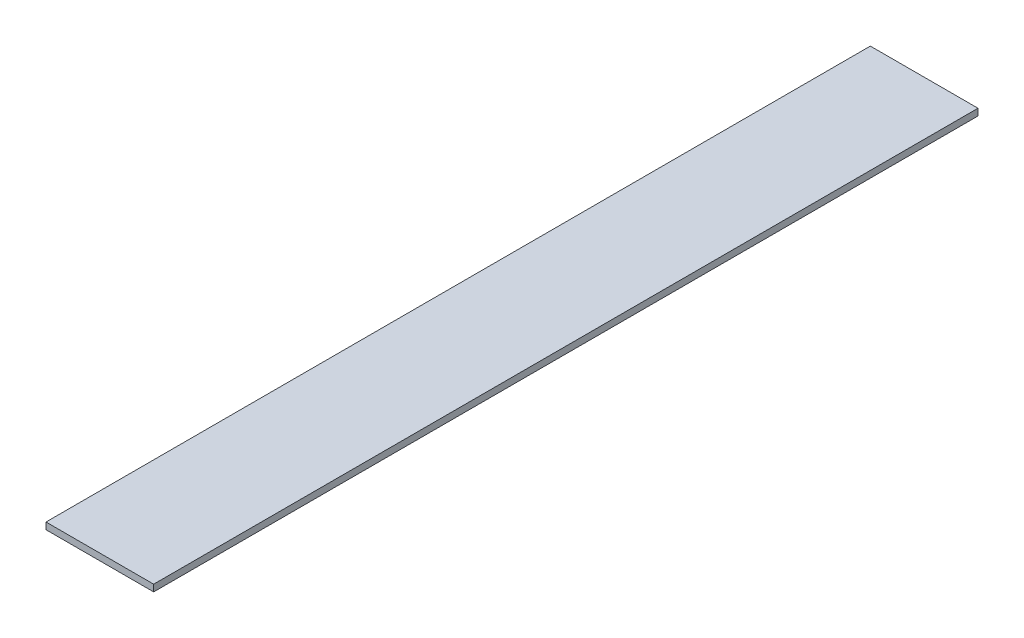
ISO-10303-21;
HEADER;
FILE_DESCRIPTION(('STEP AP214'),'2;1');
FILE_NAME('part.step','',(''),(''),'','','');
FILE_SCHEMA(('AUTOMOTIVE_DESIGN { 1 0 10303 214 1 1 1 1 }'));
ENDSEC;
DATA;
#1=APPLICATION_CONTEXT('core data for automotive mechanical design processes');
#2=APPLICATION_PROTOCOL_DEFINITION('international standard','automotive_design',2000,#1);
#3=PRODUCT_CONTEXT('',#1,'mechanical');
#4=PRODUCT('Part','Part','',(#3));
#5=PRODUCT_RELATED_PRODUCT_CATEGORY('part','',(#4));
#6=PRODUCT_DEFINITION_FORMATION('','',#4);
#7=PRODUCT_DEFINITION_CONTEXT('part definition',#1,'design');
#8=PRODUCT_DEFINITION('design','',#6,#7);
#9=PRODUCT_DEFINITION_SHAPE('','',#8);
#10=(LENGTH_UNIT() NAMED_UNIT(*) SI_UNIT(.MILLI.,.METRE.));
#11=(NAMED_UNIT(*) PLANE_ANGLE_UNIT() SI_UNIT($,.RADIAN.));
#12=(NAMED_UNIT(*) SI_UNIT($,.STERADIAN.) SOLID_ANGLE_UNIT());
#13=UNCERTAINTY_MEASURE_WITH_UNIT(LENGTH_MEASURE(1.E-05),#10,'distance_accuracy_value','');
#14=(GEOMETRIC_REPRESENTATION_CONTEXT(3) GLOBAL_UNCERTAINTY_ASSIGNED_CONTEXT((#13)) GLOBAL_UNIT_ASSIGNED_CONTEXT((#10,
#11,#12)) REPRESENTATION_CONTEXT('',''));
#15=CARTESIAN_POINT('',(0.,0.,0.));
#16=DIRECTION('',(0.,0.,1.));
#17=DIRECTION('',(1.,0.,0.));
#18=AXIS2_PLACEMENT_3D('',#15,#16,#17);
#19=CARTESIAN_POINT('',(0.,2.,0.));
#20=DIRECTION('',(1.,0.,0.));
#21=DIRECTION('',(0.,0.,-1.));
#22=AXIS2_PLACEMENT_3D('',#19,#20,#21);
#23=PLANE('',#22);
#24=DIRECTION('',(0.,0.,1.));
#25=VECTOR('',#24,1.);
#26=CARTESIAN_POINT('',(0.,0.,0.));
#27=LINE('',#26,#25);
#28=CARTESIAN_POINT('',(0.,0.,-245.));
#29=VERTEX_POINT('',#28);
#30=CARTESIAN_POINT('',(0.,0.,0.));
#31=VERTEX_POINT('',#30);
#32=EDGE_CURVE('E99',#29,#31,#27,.T.);
#33=ORIENTED_EDGE('',*,*,#32,.T.);
#34=DIRECTION('',(0.,-1.,0.));
#35=VECTOR('',#34,1.);
#36=CARTESIAN_POINT('',(0.,2.,0.));
#37=LINE('',#36,#35);
#38=CARTESIAN_POINT('',(0.,2.,0.));
#39=VERTEX_POINT('',#38);
#40=EDGE_CURVE('E11',#39,#31,#37,.T.);
#41=ORIENTED_EDGE('',*,*,#40,.F.);
#42=DIRECTION('',(0.,0.,1.));
#43=VECTOR('',#42,1.);
#44=CARTESIAN_POINT('',(0.,2.,0.));
#45=LINE('',#44,#43);
#46=CARTESIAN_POINT('',(0.,2.,-245.));
#47=VERTEX_POINT('',#46);
#48=EDGE_CURVE('E87',#47,#39,#45,.T.);
#49=ORIENTED_EDGE('',*,*,#48,.F.);
#50=DIRECTION('',(0.,-1.,0.));
#51=VECTOR('',#50,1.);
#52=CARTESIAN_POINT('',(0.,2.,-245.));
#53=LINE('',#52,#51);
#54=EDGE_CURVE('E95',#47,#29,#53,.T.);
#55=ORIENTED_EDGE('',*,*,#54,.T.);
#56=EDGE_LOOP('',(#33,#41,#49,#55));
#57=FACE_BOUND('',#56,.T.);
#58=ADVANCED_FACE('F36',(#57),#23,.F.);
#59=CARTESIAN_POINT('',(0.,2.,0.));
#60=DIRECTION('',(0.,0.,-1.));
#61=DIRECTION('',(-1.,0.,0.));
#62=AXIS2_PLACEMENT_3D('',#59,#60,#61);
#63=PLANE('',#62);
#64=DIRECTION('',(1.,0.,0.));
#65=VECTOR('',#64,1.);
#66=CARTESIAN_POINT('',(0.,0.,0.));
#67=LINE('',#66,#65);
#68=CARTESIAN_POINT('',(32.,0.,0.));
#69=VERTEX_POINT('',#68);
#70=EDGE_CURVE('E91',#31,#69,#67,.T.);
#71=ORIENTED_EDGE('',*,*,#70,.T.);
#72=DIRECTION('',(0.,-1.,0.));
#73=VECTOR('',#72,1.);
#74=CARTESIAN_POINT('',(32.,2.,0.));
#75=LINE('',#74,#73);
#76=CARTESIAN_POINT('',(32.,2.,0.));
#77=VERTEX_POINT('',#76);
#78=EDGE_CURVE('E44',#77,#69,#75,.T.);
#79=ORIENTED_EDGE('',*,*,#78,.F.);
#80=DIRECTION('',(1.,0.,0.));
#81=VECTOR('',#80,1.);
#82=CARTESIAN_POINT('',(0.,2.,0.));
#83=LINE('',#82,#81);
#84=EDGE_CURVE('E82',#39,#77,#83,.T.);
#85=ORIENTED_EDGE('',*,*,#84,.F.);
#86=ORIENTED_EDGE('',*,*,#40,.T.);
#87=EDGE_LOOP('',(#71,#79,#85,#86));
#88=FACE_BOUND('',#87,.T.);
#89=ADVANCED_FACE('F90',(#88),#63,.F.);
#90=CARTESIAN_POINT('',(32.,2.,0.));
#91=DIRECTION('',(-1.,0.,0.));
#92=DIRECTION('',(0.,0.,1.));
#93=AXIS2_PLACEMENT_3D('',#90,#91,#92);
#94=PLANE('',#93);
#95=DIRECTION('',(0.,0.,-1.));
#96=VECTOR('',#95,1.);
#97=CARTESIAN_POINT('',(32.,0.,0.));
#98=LINE('',#97,#96);
#99=CARTESIAN_POINT('',(32.,0.,-245.));
#100=VERTEX_POINT('',#99);
#101=EDGE_CURVE('E69',#69,#100,#98,.T.);
#102=ORIENTED_EDGE('',*,*,#101,.T.);
#103=DIRECTION('',(0.,-1.,0.));
#104=VECTOR('',#103,1.);
#105=CARTESIAN_POINT('',(32.,2.,-245.));
#106=LINE('',#105,#104);
#107=CARTESIAN_POINT('',(32.,2.,-245.));
#108=VERTEX_POINT('',#107);
#109=EDGE_CURVE('E92',#108,#100,#106,.T.);
#110=ORIENTED_EDGE('',*,*,#109,.F.);
#111=DIRECTION('',(0.,0.,-1.));
#112=VECTOR('',#111,1.);
#113=CARTESIAN_POINT('',(32.,2.,0.));
#114=LINE('',#113,#112);
#115=EDGE_CURVE('E85',#77,#108,#114,.T.);
#116=ORIENTED_EDGE('',*,*,#115,.F.);
#117=ORIENTED_EDGE('',*,*,#78,.T.);
#118=EDGE_LOOP('',(#102,#110,#116,#117));
#119=FACE_BOUND('',#118,.T.);
#120=ADVANCED_FACE('F93',(#119),#94,.F.);
#121=CARTESIAN_POINT('',(0.,2.,-245.));
#122=DIRECTION('',(0.,0.,1.));
#123=DIRECTION('',(1.,0.,0.));
#124=AXIS2_PLACEMENT_3D('',#121,#122,#123);
#125=PLANE('',#124);
#126=DIRECTION('',(-1.,0.,0.));
#127=VECTOR('',#126,1.);
#128=CARTESIAN_POINT('',(0.,0.,-245.));
#129=LINE('',#128,#127);
#130=EDGE_CURVE('E75',#100,#29,#129,.T.);
#131=ORIENTED_EDGE('',*,*,#130,.T.);
#132=ORIENTED_EDGE('',*,*,#54,.F.);
#133=DIRECTION('',(-1.,0.,0.));
#134=VECTOR('',#133,1.);
#135=CARTESIAN_POINT('',(0.,2.,-245.));
#136=LINE('',#135,#134);
#137=EDGE_CURVE('E52',#108,#47,#136,.T.);
#138=ORIENTED_EDGE('',*,*,#137,.F.);
#139=ORIENTED_EDGE('',*,*,#109,.T.);
#140=EDGE_LOOP('',(#131,#132,#138,#139));
#141=FACE_BOUND('',#140,.T.);
#142=ADVANCED_FACE('F106',(#141),#125,.F.);
#143=CARTESIAN_POINT('',(0.,2.,0.));
#144=DIRECTION('',(0.,-1.,0.));
#145=DIRECTION('',(0.,0.,-1.));
#146=AXIS2_PLACEMENT_3D('',#143,#144,#145);
#147=PLANE('',#146);
#148=ORIENTED_EDGE('',*,*,#48,.T.);
#149=ORIENTED_EDGE('',*,*,#84,.T.);
#150=ORIENTED_EDGE('',*,*,#115,.T.);
#151=ORIENTED_EDGE('',*,*,#137,.T.);
#152=EDGE_LOOP('',(#148,#149,#150,#151));
#153=FACE_BOUND('',#152,.T.);
#154=ADVANCED_FACE('F83',(#153),#147,.F.);
#155=CARTESIAN_POINT('',(0.,0.,0.));
#156=DIRECTION('',(0.,-1.,0.));
#157=DIRECTION('',(0.,0.,-1.));
#158=AXIS2_PLACEMENT_3D('',#155,#156,#157);
#159=PLANE('',#158);
#160=ORIENTED_EDGE('',*,*,#32,.F.);
#161=ORIENTED_EDGE('',*,*,#130,.F.);
#162=ORIENTED_EDGE('',*,*,#101,.F.);
#163=ORIENTED_EDGE('',*,*,#70,.F.);
#164=EDGE_LOOP('',(#160,#161,#162,#163));
#165=FACE_BOUND('',#164,.T.);
#166=ADVANCED_FACE('F109',(#165),#159,.T.);
#167=CLOSED_SHELL('',(#58,#89,#120,#142,#154,#166));
#168=MANIFOLD_SOLID_BREP('B2',#167);
#169=ADVANCED_BREP_SHAPE_REPRESENTATION('',(#18,#168),#14);
#170=SHAPE_DEFINITION_REPRESENTATION(#9,#169);
ENDSEC;
END-ISO-10303-21;
